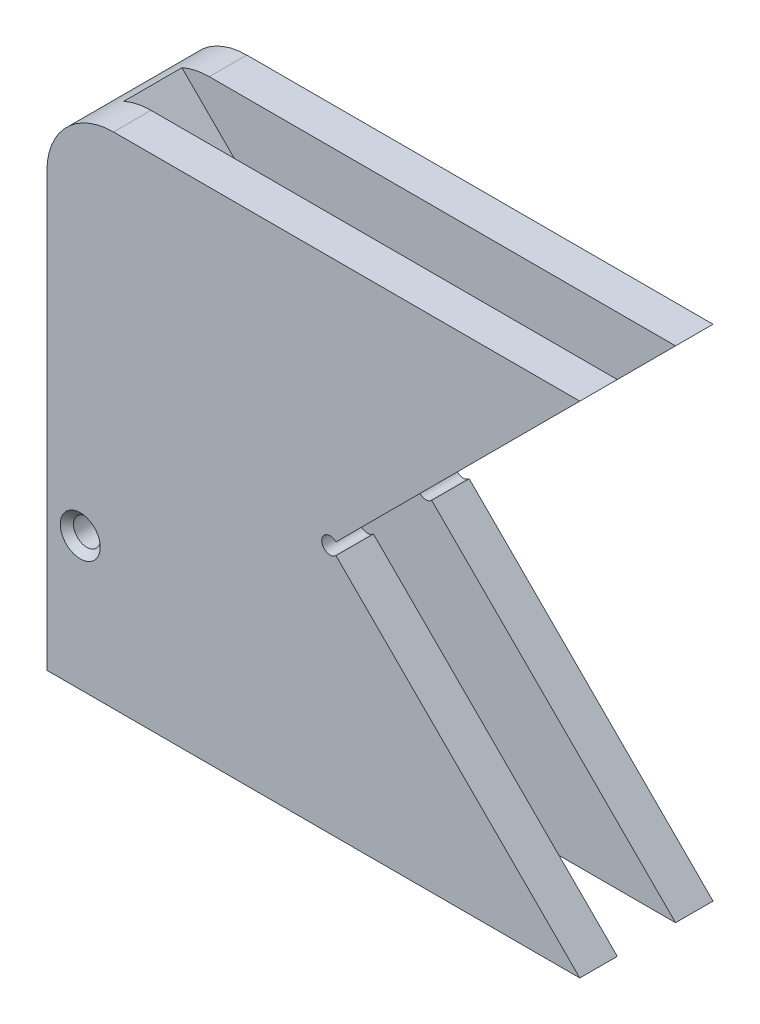
ISO-10303-21;
HEADER;
FILE_DESCRIPTION(('STEP AP214'),'2;1');
FILE_NAME('part.step','',(''),(''),'','','');
FILE_SCHEMA(('AUTOMOTIVE_DESIGN { 1 0 10303 214 1 1 1 1 }'));
ENDSEC;
DATA;
#1=APPLICATION_CONTEXT('core data for automotive mechanical design processes');
#2=APPLICATION_PROTOCOL_DEFINITION('international standard','automotive_design',2000,#1);
#3=PRODUCT_CONTEXT('',#1,'mechanical');
#4=PRODUCT('Part','Part','',(#3));
#5=PRODUCT_RELATED_PRODUCT_CATEGORY('part','',(#4));
#6=PRODUCT_DEFINITION_FORMATION('','',#4);
#7=PRODUCT_DEFINITION_CONTEXT('part definition',#1,'design');
#8=PRODUCT_DEFINITION('design','',#6,#7);
#9=PRODUCT_DEFINITION_SHAPE('','',#8);
#10=(LENGTH_UNIT() NAMED_UNIT(*) SI_UNIT(.MILLI.,.METRE.));
#11=(NAMED_UNIT(*) PLANE_ANGLE_UNIT() SI_UNIT($,.RADIAN.));
#12=(NAMED_UNIT(*) SI_UNIT($,.STERADIAN.) SOLID_ANGLE_UNIT());
#13=UNCERTAINTY_MEASURE_WITH_UNIT(LENGTH_MEASURE(1.E-05),#10,'distance_accuracy_value','');
#14=(GEOMETRIC_REPRESENTATION_CONTEXT(3) GLOBAL_UNCERTAINTY_ASSIGNED_CONTEXT((#13)) GLOBAL_UNIT_ASSIGNED_CONTEXT((#10,
#11,#12)) REPRESENTATION_CONTEXT('',''));
#15=CARTESIAN_POINT('',(0.,0.,0.));
#16=DIRECTION('',(0.,0.,1.));
#17=DIRECTION('',(1.,0.,0.));
#18=AXIS2_PLACEMENT_3D('',#15,#16,#17);
#19=CARTESIAN_POINT('',(53.9749999999995,47.625,12.7));
#20=DIRECTION('',(0.,0.,1.));
#21=DIRECTION('',(1.,0.,0.));
#22=AXIS2_PLACEMENT_3D('',#19,#20,#21);
#23=CYLINDRICAL_SURFACE('',#22,1.58749999999998);
#24=CARTESIAN_POINT('',(53.9749999999995,47.625,-5.55625));
#25=DIRECTION('',(0.,0.,1.));
#26=DIRECTION('',(1.,0.,0.));
#27=AXIS2_PLACEMENT_3D('',#24,#25,#26);
#28=CIRCLE('',#27,1.58749999999998);
#29=CARTESIAN_POINT('',(55.0975320151331,46.5024679848664,-5.55625));
#30=VERTEX_POINT('',#29);
#31=CARTESIAN_POINT('',(52.8524679848658,46.5024679848664,-5.55625));
#32=VERTEX_POINT('',#31);
#33=EDGE_CURVE('E587',#30,#32,#28,.F.);
#34=ORIENTED_EDGE('',*,*,#33,.F.);
#35=DIRECTION('',(0.,0.,1.));
#36=VECTOR('',#35,1.);
#37=CARTESIAN_POINT('',(55.0975320151331,46.5024679848664,12.7));
#38=LINE('',#37,#36);
#39=CARTESIAN_POINT('',(55.0975320151331,46.5024679848664,-12.7));
#40=VERTEX_POINT('',#39);
#41=EDGE_CURVE('E263',#40,#30,#38,.T.);
#42=ORIENTED_EDGE('',*,*,#41,.F.);
#43=CARTESIAN_POINT('',(53.9749999999995,47.625,-12.7));
#44=DIRECTION('',(0.,0.,1.));
#45=DIRECTION('',(1.,0.,0.));
#46=AXIS2_PLACEMENT_3D('',#43,#44,#45);
#47=CIRCLE('',#46,1.58749999999998);
#48=CARTESIAN_POINT('',(55.0975320151331,48.7475320151336,-12.7));
#49=VERTEX_POINT('',#48);
#50=EDGE_CURVE('E275',#49,#40,#47,.T.);
#51=ORIENTED_EDGE('',*,*,#50,.F.);
#52=DIRECTION('',(0.,0.,1.));
#53=VECTOR('',#52,1.);
#54=CARTESIAN_POINT('',(55.0975320151331,48.7475320151336,12.7));
#55=LINE('',#54,#53);
#56=CARTESIAN_POINT('',(55.0975320151331,48.7475320151336,-5.55625));
#57=VERTEX_POINT('',#56);
#58=EDGE_CURVE('E561',#57,#49,#55,.F.);
#59=ORIENTED_EDGE('',*,*,#58,.F.);
#60=CARTESIAN_POINT('',(53.9749999999995,47.625,-5.55625));
#61=DIRECTION('',(0.,0.,1.));
#62=DIRECTION('',(1.,0.,0.));
#63=AXIS2_PLACEMENT_3D('',#60,#61,#62);
#64=CIRCLE('',#63,1.58749999999998);
#65=CARTESIAN_POINT('',(52.8524679848658,48.7475320151336,-5.55625));
#66=VERTEX_POINT('',#65);
#67=EDGE_CURVE('E601',#66,#57,#64,.F.);
#68=ORIENTED_EDGE('',*,*,#67,.F.);
#69=DIRECTION('',(0.,0.,1.));
#70=VECTOR('',#69,1.);
#71=CARTESIAN_POINT('',(52.8524679848658,48.7475320151336,12.7));
#72=LINE('',#71,#70);
#73=CARTESIAN_POINT('',(52.8524679848658,48.7475320151336,5.55625));
#74=VERTEX_POINT('',#73);
#75=EDGE_CURVE('E590',#74,#66,#72,.F.);
#76=ORIENTED_EDGE('',*,*,#75,.F.);
#77=CARTESIAN_POINT('',(53.9749999999995,47.625,5.55625));
#78=DIRECTION('',(0.,0.,1.));
#79=DIRECTION('',(1.,0.,0.));
#80=AXIS2_PLACEMENT_3D('',#77,#78,#79);
#81=CIRCLE('',#80,1.58749999999998);
#82=CARTESIAN_POINT('',(55.0975320151331,48.7475320151336,5.55625));
#83=VERTEX_POINT('',#82);
#84=EDGE_CURVE('E585',#74,#83,#81,.F.);
#85=ORIENTED_EDGE('',*,*,#84,.T.);
#86=CARTESIAN_POINT('',(55.0975320151331,48.7475320151336,12.7));
#87=VERTEX_POINT('',#86);
#88=EDGE_CURVE('E562',#87,#83,#55,.F.);
#89=ORIENTED_EDGE('',*,*,#88,.F.);
#90=CARTESIAN_POINT('',(53.9749999999995,47.625,12.7));
#91=DIRECTION('',(0.,0.,1.));
#92=DIRECTION('',(1.,0.,0.));
#93=AXIS2_PLACEMENT_3D('',#90,#91,#92);
#94=CIRCLE('',#93,1.58749999999998);
#95=CARTESIAN_POINT('',(55.0975320151331,46.5024679848664,12.7));
#96=VERTEX_POINT('',#95);
#97=EDGE_CURVE('E550',#87,#96,#94,.T.);
#98=ORIENTED_EDGE('',*,*,#97,.T.);
#99=CARTESIAN_POINT('',(55.0975320151331,46.5024679848664,5.55625));
#100=VERTEX_POINT('',#99);
#101=EDGE_CURVE('E565',#100,#96,#38,.T.);
#102=ORIENTED_EDGE('',*,*,#101,.F.);
#103=CARTESIAN_POINT('',(53.9749999999995,47.625,5.55625));
#104=DIRECTION('',(0.,0.,1.));
#105=DIRECTION('',(1.,0.,0.));
#106=AXIS2_PLACEMENT_3D('',#103,#104,#105);
#107=CIRCLE('',#106,1.58749999999998);
#108=CARTESIAN_POINT('',(52.8524679848658,46.5024679848664,5.55625));
#109=VERTEX_POINT('',#108);
#110=EDGE_CURVE('E71',#100,#109,#107,.F.);
#111=ORIENTED_EDGE('',*,*,#110,.T.);
#112=DIRECTION('',(0.,0.,1.));
#113=VECTOR('',#112,1.);
#114=CARTESIAN_POINT('',(52.8524679848658,46.5024679848664,12.7));
#115=LINE('',#114,#113);
#116=EDGE_CURVE('E292',#32,#109,#115,.T.);
#117=ORIENTED_EDGE('',*,*,#116,.F.);
#118=EDGE_LOOP('',(#34,#42,#51,#59,#68,#76,#85,#89,#98,#102,#111,#117));
#119=FACE_BOUND('',#118,.T.);
#120=ADVANCED_FACE('F56',(#119),#23,.F.);
#121=CARTESIAN_POINT('',(101.6,0.,12.7));
#122=DIRECTION('',(0.,1.,0.));
#123=DIRECTION('',(-1.,0.,0.));
#124=AXIS2_PLACEMENT_3D('',#121,#122,#123);
#125=PLANE('',#124);
#126=DIRECTION('',(1.,0.,0.));
#127=VECTOR('',#126,1.);
#128=CARTESIAN_POINT('',(0.,0.,-5.55625));
#129=LINE('',#128,#127);
#130=CARTESIAN_POINT('',(6.34999999999897,0.,-5.55625));
#131=VERTEX_POINT('',#130);
#132=CARTESIAN_POINT('',(101.6,0.,-5.55625));
#133=VERTEX_POINT('',#132);
#134=EDGE_CURVE('E276',#131,#133,#129,.T.);
#135=ORIENTED_EDGE('',*,*,#134,.F.);
#136=DIRECTION('',(0.,0.,1.));
#137=VECTOR('',#136,1.);
#138=CARTESIAN_POINT('',(6.34999999999897,0.,-5.55625));
#139=LINE('',#138,#137);
#140=CARTESIAN_POINT('',(6.34999999999897,0.,5.55625));
#141=VERTEX_POINT('',#140);
#142=EDGE_CURVE('E191',#131,#141,#139,.T.);
#143=ORIENTED_EDGE('',*,*,#142,.T.);
#144=DIRECTION('',(1.,0.,0.));
#145=VECTOR('',#144,1.);
#146=CARTESIAN_POINT('',(0.,0.,5.55625));
#147=LINE('',#146,#145);
#148=CARTESIAN_POINT('',(101.6,0.,5.55625));
#149=VERTEX_POINT('',#148);
#150=EDGE_CURVE('E179',#141,#149,#147,.T.);
#151=ORIENTED_EDGE('',*,*,#150,.T.);
#152=DIRECTION('',(0.,0.,-1.));
#153=VECTOR('',#152,1.);
#154=CARTESIAN_POINT('',(101.6,0.,12.7));
#155=LINE('',#154,#153);
#156=CARTESIAN_POINT('',(101.6,0.,12.7));
#157=VERTEX_POINT('',#156);
#158=EDGE_CURVE('E190',#157,#149,#155,.T.);
#159=ORIENTED_EDGE('',*,*,#158,.F.);
#160=DIRECTION('',(1.,0.,0.));
#161=VECTOR('',#160,1.);
#162=CARTESIAN_POINT('',(101.6,0.,12.7));
#163=LINE('',#162,#161);
#164=CARTESIAN_POINT('',(0.,0.,12.7));
#165=VERTEX_POINT('',#164);
#166=EDGE_CURVE('E242',#165,#157,#163,.T.);
#167=ORIENTED_EDGE('',*,*,#166,.F.);
#168=DIRECTION('',(0.,0.,-1.));
#169=VECTOR('',#168,1.);
#170=CARTESIAN_POINT('',(0.,0.,12.7));
#171=LINE('',#170,#169);
#172=CARTESIAN_POINT('',(0.,0.,-12.7));
#173=VERTEX_POINT('',#172);
#174=EDGE_CURVE('E247',#165,#173,#171,.T.);
#175=ORIENTED_EDGE('',*,*,#174,.T.);
#176=DIRECTION('',(1.,0.,0.));
#177=VECTOR('',#176,1.);
#178=CARTESIAN_POINT('',(101.6,0.,-12.7));
#179=LINE('',#178,#177);
#180=CARTESIAN_POINT('',(101.6,0.,-12.7));
#181=VERTEX_POINT('',#180);
#182=EDGE_CURVE('E262',#173,#181,#179,.T.);
#183=ORIENTED_EDGE('',*,*,#182,.T.);
#184=EDGE_CURVE('E199',#133,#181,#155,.T.);
#185=ORIENTED_EDGE('',*,*,#184,.F.);
#186=EDGE_LOOP('',(#135,#143,#151,#159,#167,#175,#183,#185));
#187=FACE_BOUND('',#186,.T.);
#188=ADVANCED_FACE('F188',(#187),#125,.F.);
#189=CARTESIAN_POINT('',(53.9749999999995,47.625,12.7));
#190=DIRECTION('',(-0.707106781186544,-0.707106781186551,0.));
#191=DIRECTION('',(0.707106781186551,-0.707106781186544,0.));
#192=AXIS2_PLACEMENT_3D('',#189,#190,#191);
#193=PLANE('',#192);
#194=DIRECTION('',(-0.707106781186551,0.707106781186544,0.));
#195=VECTOR('',#194,1.);
#196=CARTESIAN_POINT('',(50.7999999999995,50.8,-5.55625));
#197=LINE('',#196,#195);
#198=EDGE_CURVE('E279',#133,#30,#197,.T.);
#199=ORIENTED_EDGE('',*,*,#198,.F.);
#200=ORIENTED_EDGE('',*,*,#184,.T.);
#201=DIRECTION('',(-0.707106781186552,0.707106781186544,0.));
#202=VECTOR('',#201,1.);
#203=CARTESIAN_POINT('',(53.9749999999995,47.625,-12.7));
#204=LINE('',#203,#202);
#205=EDGE_CURVE('E244',#181,#40,#204,.T.);
#206=ORIENTED_EDGE('',*,*,#205,.T.);
#207=ORIENTED_EDGE('',*,*,#41,.T.);
#208=EDGE_LOOP('',(#199,#200,#206,#207));
#209=FACE_BOUND('',#208,.T.);
#210=ADVANCED_FACE('F269',(#209),#193,.F.);
#211=CARTESIAN_POINT('',(15.875,9.525,0.));
#212=DIRECTION('',(-1.,0.,0.));
#213=DIRECTION('',(0.,0.,1.));
#214=AXIS2_PLACEMENT_3D('',#211,#212,#213);
#215=CONICAL_SURFACE('',#214,2.5527,1.02974425867665);
#216=CARTESIAN_POINT('',(15.8748798261767,9.52487982617759,2.5529));
#217=CARTESIAN_POINT('',(15.9031939186595,9.55319391866041,2.50577588170965));
#218=CARTESIAN_POINT('',(15.9313457759996,9.58134577600052,2.45845709519709));
#219=CARTESIAN_POINT('',(15.9872716049516,9.63727160495253,2.36336911620556));
#220=CARTESIAN_POINT('',(16.0150455475612,9.66504554756214,2.31559988962942));
#221=CARTESIAN_POINT('',(16.0978135125158,9.7478135125167,2.17136219448809));
#222=CARTESIAN_POINT('',(16.1521509233622,9.80215092336312,2.07413362651583));
#223=CARTESIAN_POINT('',(16.2596895950018,9.90968959500269,1.8746997010346));
#224=CARTESIAN_POINT('',(16.3128323197108,9.96283231971171,1.77243090670956));
#225=CARTESIAN_POINT('',(16.415468556119,10.0654685561199,1.56434644994297));
#226=CARTESIAN_POINT('',(16.4649648241413,10.1149648241422,1.45853355632126));
#227=CARTESIAN_POINT('',(16.5382286173355,10.1882286173364,1.28915927663996));
#228=CARTESIAN_POINT('',(16.5638378724397,10.2138378724406,1.22719590676887));
#229=CARTESIAN_POINT('',(16.612848185701,10.2628481857019,1.1015170895771));
#230=CARTESIAN_POINT('',(16.636248886237,10.286248886238,1.0378013606547));
#231=CARTESIAN_POINT('',(16.6801255517014,10.3301255517023,0.908746666402781));
#232=CARTESIAN_POINT('',(16.7006150790324,10.3506150790334,0.843417012663825));
#233=CARTESIAN_POINT('',(16.7380464185868,10.3880464185877,0.710747024741038));
#234=CARTESIAN_POINT('',(16.754989546657,10.4049895466579,0.643407446948488));
#235=CARTESIAN_POINT('',(16.7809355892986,10.4309355892995,0.523179370049381));
#236=CARTESIAN_POINT('',(16.7908683095647,10.4408683095656,0.470693799866638));
#237=CARTESIAN_POINT('',(16.8078011903305,10.4578011903314,0.364790336923779));
#238=CARTESIAN_POINT('',(16.8148023786831,10.4648023786841,0.311372777791738));
#239=CARTESIAN_POINT('',(16.8255423544634,10.4755423544643,0.203993498806694));
#240=CARTESIAN_POINT('',(16.8292880877681,10.479288087769,0.150033187228521));
#241=CARTESIAN_POINT('',(16.8333485858833,10.4833485858843,0.0418521600883942));
#242=CARTESIAN_POINT('',(16.8336634316095,10.4836634316104,-0.0123685493020445));
#243=CARTESIAN_POINT('',(16.8308447636784,10.4808447636793,-0.120644908531216));
#244=CARTESIAN_POINT('',(16.8277101543086,10.4777101543095,-0.174700500449924));
#245=CARTESIAN_POINT('',(16.8181553274404,10.4681553274413,-0.282222917462849));
#246=CARTESIAN_POINT('',(16.8117348658582,10.4617348658591,-0.335689698516842));
#247=CARTESIAN_POINT('',(16.7958886339647,10.4458886339656,-0.441874815631848));
#248=CARTESIAN_POINT('',(16.7864542760773,10.4364542760782,-0.494590557841094));
#249=CARTESIAN_POINT('',(16.7649620742098,10.4149620742107,-0.598926642098872));
#250=CARTESIAN_POINT('',(16.7529041774132,10.4029041774141,-0.650546962071636));
#251=CARTESIAN_POINT('',(16.7096374535299,10.3596374535308,-0.818186985193854));
#252=CARTESIAN_POINT('',(16.6737201289875,10.3237201289884,-0.931779962229897));
#253=CARTESIAN_POINT('',(16.5941763825453,10.2441763825462,-1.15346396281501));
#254=CARTESIAN_POINT('',(16.5505344394579,10.2005344394588,-1.26154333373507));
#255=CARTESIAN_POINT('',(16.4578859280128,10.1078859280137,-1.47391290846575));
#256=CARTESIAN_POINT('',(16.4088463881815,10.0588463881824,-1.57817397556247));
#257=CARTESIAN_POINT('',(16.307334221307,9.95733422130788,-1.78312634532815));
#258=CARTESIAN_POINT('',(16.2548643981969,9.9048643981978,-1.88382046234475));
#259=CARTESIAN_POINT('',(16.148424831264,9.79842483126492,-2.08086065173777));
#260=CARTESIAN_POINT('',(16.0944963971004,9.74449639710129,-2.17725171801636));
#261=CARTESIAN_POINT('',(15.9855142917619,9.63551429176282,-2.36695128688017));
#262=CARTESIAN_POINT('',(15.9304803034942,9.5804803034951,-2.46028234559523));
#263=CARTESIAN_POINT('',(15.8748798261767,9.52487982617759,-2.5529));
#264=B_SPLINE_CURVE_WITH_KNOTS('',3,(#216,#217,#218,#219,#220,#221,#222,#223,#224,#225,#226,
#227,#228,#229,#230,#231,#232,#233,#234,#235,#236,#237,#238,#239,#240,#241,#242,#243,#244,#245,
#246,#247,#248,#249,#250,#251,#252,#253,#254,#255,#256,#257,#258,#259,#260,#261,#262,#263),
.UNSPECIFIED.,.F.,.F.,(4,2,2,2,2,2,2,2,2,2,2,2,2,2,2,2,2,2,2,2,2,2,2,4),(0.,0.185515144746626,
0.371044447086561,0.742773614364699,1.12342131631233,1.50377827344698,1.71902444799836,
1.93430541678868,2.1485480268962,2.36271100350883,2.52556574639168,2.68836334127838,
2.85081273053103,3.01325828849386,3.17575546186692,3.3382647078093,3.501241188773,
3.6642209510474,4.03649394436539,4.40952362309005,4.78497374032631,5.16012070952659,
5.5288164733068,5.89333314906287),.UNSPECIFIED.);
#265=CARTESIAN_POINT('',(15.875,9.52500000000092,2.5527));
#266=VERTEX_POINT('',#265);
#267=CARTESIAN_POINT('',(15.875,9.52500000000092,-2.5527));
#268=VERTEX_POINT('',#267);
#269=EDGE_CURVE('E77',#266,#268,#264,.T.);
#270=ORIENTED_EDGE('',*,*,#269,.F.);
#271=CARTESIAN_POINT('',(15.875,9.525,0.));
#272=DIRECTION('',(-1.,0.,0.));
#273=DIRECTION('',(0.,0.,1.));
#274=AXIS2_PLACEMENT_3D('',#271,#272,#273);
#275=CIRCLE('',#274,2.5527);
#276=EDGE_CURVE('E618',#266,#268,#275,.T.);
#277=ORIENTED_EDGE('',*,*,#276,.T.);
#278=EDGE_LOOP('',(#270,#277));
#279=FACE_BOUND('',#278,.T.);
#280=ADVANCED_FACE('F294',(#279),#215,.F.);
#281=CARTESIAN_POINT('',(0.,9.525,0.));
#282=DIRECTION('',(-1.,0.,0.));
#283=DIRECTION('',(0.,0.,1.));
#284=AXIS2_PLACEMENT_3D('',#281,#282,#283);
#285=CYLINDRICAL_SURFACE('',#284,2.5527);
#286=CARTESIAN_POINT('',(1.2573,9.525,0.));
#287=DIRECTION('',(-1.,0.,0.));
#288=DIRECTION('',(0.,0.,1.));
#289=AXIS2_PLACEMENT_3D('',#286,#287,#288);
#290=CIRCLE('',#289,2.5527);
#291=CARTESIAN_POINT('',(1.2573,9.525,2.5527));
#292=VERTEX_POINT('',#291);
#293=EDGE_CURVE('E616',#292,#292,#290,.T.);
#294=ORIENTED_EDGE('',*,*,#293,.T.);
#295=EDGE_LOOP('',(#294));
#296=FACE_BOUND('',#295,.T.);
#297=CARTESIAN_POINT('',(15.8749999999991,9.525,0.));
#298=DIRECTION('',(0.707106781186544,-0.707106781186551,0.));
#299=DIRECTION('',(-0.707106781186551,-0.707106781186544,0.));
#300=AXIS2_PLACEMENT_3D('',#297,#298,#299);
#301=ELLIPSE('',#300,3.61006296066981,2.5527);
#302=EDGE_CURVE('E12',#268,#266,#301,.F.);
#303=ORIENTED_EDGE('',*,*,#302,.F.);
#304=ORIENTED_EDGE('',*,*,#276,.F.);
#305=EDGE_LOOP('',(#303,#304));
#306=FACE_BOUND('',#305,.T.);
#307=ADVANCED_FACE('F334',(#296,#306),#285,.F.);
#308=CARTESIAN_POINT('',(101.6,95.25,12.7));
#309=DIRECTION('',(-0.707106781186544,0.707106781186551,0.));
#310=DIRECTION('',(-0.707106781186551,-0.707106781186544,0.));
#311=AXIS2_PLACEMENT_3D('',#308,#309,#310);
#312=PLANE('',#311);
#313=DIRECTION('',(0.707106781186551,0.707106781186544,0.));
#314=VECTOR('',#313,1.);
#315=CARTESIAN_POINT('',(3.17499999999945,-3.17499999999948,-5.55625));
#316=LINE('',#315,#314);
#317=CARTESIAN_POINT('',(101.6,95.25,-5.55625));
#318=VERTEX_POINT('',#317);
#319=EDGE_CURVE('E592',#57,#318,#316,.T.);
#320=ORIENTED_EDGE('',*,*,#319,.F.);
#321=ORIENTED_EDGE('',*,*,#58,.T.);
#322=DIRECTION('',(0.707106781186551,0.707106781186544,0.));
#323=VECTOR('',#322,1.);
#324=CARTESIAN_POINT('',(101.6,95.25,-12.7));
#325=LINE('',#324,#323);
#326=CARTESIAN_POINT('',(101.6,95.25,-12.7));
#327=VERTEX_POINT('',#326);
#328=EDGE_CURVE('E240',#49,#327,#325,.T.);
#329=ORIENTED_EDGE('',*,*,#328,.T.);
#330=DIRECTION('',(0.,0.,-1.));
#331=VECTOR('',#330,1.);
#332=CARTESIAN_POINT('',(101.6,95.25,12.7));
#333=LINE('',#332,#331);
#334=EDGE_CURVE('E235',#318,#327,#333,.T.);
#335=ORIENTED_EDGE('',*,*,#334,.F.);
#336=EDGE_LOOP('',(#320,#321,#329,#335));
#337=FACE_BOUND('',#336,.T.);
#338=ADVANCED_FACE('F336',(#337),#312,.F.);
#339=CARTESIAN_POINT('',(0.,95.25,12.7));
#340=DIRECTION('',(0.,-1.,0.));
#341=DIRECTION('',(0.,0.,-1.));
#342=AXIS2_PLACEMENT_3D('',#339,#340,#341);
#343=PLANE('',#342);
#344=DIRECTION('',(-1.,0.,0.));
#345=VECTOR('',#344,1.);
#346=CARTESIAN_POINT('',(0.,95.25,-5.55625));
#347=LINE('',#346,#345);
#348=CARTESIAN_POINT('',(12.7,95.25,-5.55625));
#349=VERTEX_POINT('',#348);
#350=EDGE_CURVE('E231',#318,#349,#347,.T.);
#351=ORIENTED_EDGE('',*,*,#350,.F.);
#352=ORIENTED_EDGE('',*,*,#334,.T.);
#353=DIRECTION('',(-1.,0.,0.));
#354=VECTOR('',#353,1.);
#355=CARTESIAN_POINT('',(0.,95.25,-12.7));
#356=LINE('',#355,#354);
#357=CARTESIAN_POINT('',(12.7,95.25,-12.7));
#358=VERTEX_POINT('',#357);
#359=EDGE_CURVE('E234',#327,#358,#356,.T.);
#360=ORIENTED_EDGE('',*,*,#359,.T.);
#361=DIRECTION('',(0.,0.,-1.));
#362=VECTOR('',#361,1.);
#363=CARTESIAN_POINT('',(12.7,95.25,12.7));
#364=LINE('',#363,#362);
#365=EDGE_CURVE('E210',#358,#349,#364,.F.);
#366=ORIENTED_EDGE('',*,*,#365,.T.);
#367=EDGE_LOOP('',(#351,#352,#360,#366));
#368=FACE_BOUND('',#367,.T.);
#369=ADVANCED_FACE('F230',(#368),#343,.F.);
#370=CARTESIAN_POINT('',(12.7,82.55,12.7));
#371=DIRECTION('',(0.,0.,-1.));
#372=DIRECTION('',(-1.,0.,0.));
#373=AXIS2_PLACEMENT_3D('',#370,#371,#372);
#374=CYLINDRICAL_SURFACE('',#373,12.7);
#375=DIRECTION('',(0.,0.,-1.));
#376=VECTOR('',#375,1.);
#377=CARTESIAN_POINT('',(7.47473958736923,94.1252604126298,12.7));
#378=LINE('',#377,#376);
#379=CARTESIAN_POINT('',(7.47473958736923,94.1252604126298,5.55625));
#380=VERTEX_POINT('',#379);
#381=CARTESIAN_POINT('',(7.47473958736923,94.1252604126298,-5.55625));
#382=VERTEX_POINT('',#381);
#383=EDGE_CURVE('E217',#380,#382,#378,.T.);
#384=ORIENTED_EDGE('',*,*,#383,.T.);
#385=CARTESIAN_POINT('',(12.7,82.55,-5.55625));
#386=DIRECTION('',(0.,0.,1.));
#387=DIRECTION('',(1.,0.,0.));
#388=AXIS2_PLACEMENT_3D('',#385,#386,#387);
#389=CIRCLE('',#388,12.7);
#390=EDGE_CURVE('E64',#382,#349,#389,.F.);
#391=ORIENTED_EDGE('',*,*,#390,.T.);
#392=ORIENTED_EDGE('',*,*,#365,.F.);
#393=CARTESIAN_POINT('',(12.7,82.55,-12.7));
#394=DIRECTION('',(0.,0.,-1.));
#395=DIRECTION('',(-1.,0.,0.));
#396=AXIS2_PLACEMENT_3D('',#393,#394,#395);
#397=CIRCLE('',#396,12.7);
#398=CARTESIAN_POINT('',(0.,82.55,-12.7));
#399=VERTEX_POINT('',#398);
#400=EDGE_CURVE('E202',#399,#358,#397,.T.);
#401=ORIENTED_EDGE('',*,*,#400,.F.);
#402=DIRECTION('',(0.,0.,-1.));
#403=VECTOR('',#402,1.);
#404=CARTESIAN_POINT('',(0.,82.55,12.7));
#405=LINE('',#404,#403);
#406=CARTESIAN_POINT('',(0.,82.55,12.7));
#407=VERTEX_POINT('',#406);
#408=EDGE_CURVE('E198',#407,#399,#405,.T.);
#409=ORIENTED_EDGE('',*,*,#408,.F.);
#410=CARTESIAN_POINT('',(12.7,82.55,12.7));
#411=DIRECTION('',(0.,0.,-1.));
#412=DIRECTION('',(-1.,0.,0.));
#413=AXIS2_PLACEMENT_3D('',#410,#411,#412);
#414=CIRCLE('',#413,12.7);
#415=CARTESIAN_POINT('',(12.7,95.25,12.7));
#416=VERTEX_POINT('',#415);
#417=EDGE_CURVE('E213',#416,#407,#414,.F.);
#418=ORIENTED_EDGE('',*,*,#417,.F.);
#419=CARTESIAN_POINT('',(12.7,95.25,5.55625));
#420=VERTEX_POINT('',#419);
#421=EDGE_CURVE('E209',#420,#416,#364,.F.);
#422=ORIENTED_EDGE('',*,*,#421,.F.);
#423=CARTESIAN_POINT('',(12.7,82.55,5.55625));
#424=DIRECTION('',(0.,0.,1.));
#425=DIRECTION('',(1.,0.,0.));
#426=AXIS2_PLACEMENT_3D('',#423,#424,#425);
#427=CIRCLE('',#426,12.7);
#428=EDGE_CURVE('E215',#380,#420,#427,.F.);
#429=ORIENTED_EDGE('',*,*,#428,.F.);
#430=EDGE_LOOP('',(#384,#391,#392,#401,#409,#418,#422,#429));
#431=FACE_BOUND('',#430,.T.);
#432=ADVANCED_FACE('F58',(#431),#374,.T.);
#433=CARTESIAN_POINT('',(0.,0.,12.7));
#434=DIRECTION('',(0.,0.,-1.));
#435=DIRECTION('',(-1.,0.,0.));
#436=AXIS2_PLACEMENT_3D('',#433,#434,#435);
#437=PLANE('',#436);
#438=DIRECTION('',(-1.,0.,0.));
#439=VECTOR('',#438,1.);
#440=CARTESIAN_POINT('',(0.,95.25,12.7));
#441=LINE('',#440,#439);
#442=CARTESIAN_POINT('',(101.6,95.25,12.7));
#443=VERTEX_POINT('',#442);
#444=EDGE_CURVE('E253',#443,#416,#441,.T.);
#445=ORIENTED_EDGE('',*,*,#444,.T.);
#446=ORIENTED_EDGE('',*,*,#417,.T.);
#447=DIRECTION('',(0.,-1.,0.));
#448=VECTOR('',#447,1.);
#449=CARTESIAN_POINT('',(0.,0.,12.7));
#450=LINE('',#449,#448);
#451=EDGE_CURVE('E249',#407,#165,#450,.T.);
#452=ORIENTED_EDGE('',*,*,#451,.T.);
#453=ORIENTED_EDGE('',*,*,#166,.T.);
#454=DIRECTION('',(-0.707106781186552,0.707106781186544,0.));
#455=VECTOR('',#454,1.);
#456=CARTESIAN_POINT('',(53.9749999999995,47.625,12.7));
#457=LINE('',#456,#455);
#458=EDGE_CURVE('E196',#157,#96,#457,.T.);
#459=ORIENTED_EDGE('',*,*,#458,.T.);
#460=ORIENTED_EDGE('',*,*,#97,.F.);
#461=DIRECTION('',(0.707106781186551,0.707106781186544,0.));
#462=VECTOR('',#461,1.);
#463=CARTESIAN_POINT('',(101.6,95.25,12.7));
#464=LINE('',#463,#462);
#465=EDGE_CURVE('E258',#87,#443,#464,.T.);
#466=ORIENTED_EDGE('',*,*,#465,.T.);
#467=EDGE_LOOP('',(#445,#446,#452,#453,#459,#460,#466));
#468=FACE_BOUND('',#467,.T.);
#469=CARTESIAN_POINT('',(6.35,25.4,12.7));
#470=DIRECTION('',(0.,0.,1.));
#471=DIRECTION('',(1.,0.,0.));
#472=AXIS2_PLACEMENT_3D('',#469,#470,#471);
#473=CIRCLE('',#472,3.81);
#474=CARTESIAN_POINT('',(10.16,25.4,12.7));
#475=VERTEX_POINT('',#474);
#476=EDGE_CURVE('E556',#475,#475,#473,.T.);
#477=ORIENTED_EDGE('',*,*,#476,.F.);
#478=EDGE_LOOP('',(#477));
#479=FACE_BOUND('',#478,.T.);
#480=ADVANCED_FACE('F359',(#468,#479),#437,.F.);
#481=CARTESIAN_POINT('',(0.,0.,-12.7));
#482=DIRECTION('',(0.,0.,-1.));
#483=DIRECTION('',(-1.,0.,0.));
#484=AXIS2_PLACEMENT_3D('',#481,#482,#483);
#485=PLANE('',#484);
#486=CARTESIAN_POINT('',(6.35,25.4,-12.7));
#487=DIRECTION('',(0.,0.,1.));
#488=DIRECTION('',(1.,0.,0.));
#489=AXIS2_PLACEMENT_3D('',#486,#487,#488);
#490=CIRCLE('',#489,3.80999999999999);
#491=CARTESIAN_POINT('',(10.16,25.4,-12.7));
#492=VERTEX_POINT('',#491);
#493=EDGE_CURVE('E546',#492,#492,#490,.T.);
#494=ORIENTED_EDGE('',*,*,#493,.T.);
#495=EDGE_LOOP('',(#494));
#496=FACE_BOUND('',#495,.T.);
#497=DIRECTION('',(0.,-1.,0.));
#498=VECTOR('',#497,1.);
#499=CARTESIAN_POINT('',(0.,0.,-12.7));
#500=LINE('',#499,#498);
#501=EDGE_CURVE('E239',#399,#173,#500,.T.);
#502=ORIENTED_EDGE('',*,*,#501,.F.);
#503=ORIENTED_EDGE('',*,*,#400,.T.);
#504=ORIENTED_EDGE('',*,*,#359,.F.);
#505=ORIENTED_EDGE('',*,*,#328,.F.);
#506=ORIENTED_EDGE('',*,*,#50,.T.);
#507=ORIENTED_EDGE('',*,*,#205,.F.);
#508=ORIENTED_EDGE('',*,*,#182,.F.);
#509=EDGE_LOOP('',(#502,#503,#504,#505,#506,#507,#508));
#510=FACE_BOUND('',#509,.T.);
#511=ADVANCED_FACE('F273',(#496,#510),#485,.T.);
#512=ORIENTED_EDGE('',*,*,#158,.T.);
#513=DIRECTION('',(-0.707106781186551,0.707106781186544,0.));
#514=VECTOR('',#513,1.);
#515=CARTESIAN_POINT('',(50.7999999999995,50.8,5.55625));
#516=LINE('',#515,#514);
#517=EDGE_CURVE('E176',#149,#100,#516,.T.);
#518=ORIENTED_EDGE('',*,*,#517,.T.);
#519=ORIENTED_EDGE('',*,*,#101,.T.);
#520=ORIENTED_EDGE('',*,*,#458,.F.);
#521=EDGE_LOOP('',(#512,#518,#519,#520));
#522=FACE_BOUND('',#521,.T.);
#523=ADVANCED_FACE('F194',(#522),#193,.F.);
#524=ORIENTED_EDGE('',*,*,#88,.T.);
#525=DIRECTION('',(0.707106781186551,0.707106781186544,0.));
#526=VECTOR('',#525,1.);
#527=CARTESIAN_POINT('',(3.17499999999945,-3.17499999999948,5.55625));
#528=LINE('',#527,#526);
#529=CARTESIAN_POINT('',(101.6,95.25,5.55625));
#530=VERTEX_POINT('',#529);
#531=EDGE_CURVE('E576',#83,#530,#528,.T.);
#532=ORIENTED_EDGE('',*,*,#531,.T.);
#533=EDGE_CURVE('E204',#443,#530,#333,.T.);
#534=ORIENTED_EDGE('',*,*,#533,.F.);
#535=ORIENTED_EDGE('',*,*,#465,.F.);
#536=EDGE_LOOP('',(#524,#532,#534,#535));
#537=FACE_BOUND('',#536,.T.);
#538=ADVANCED_FACE('F344',(#537),#312,.F.);
#539=ORIENTED_EDGE('',*,*,#533,.T.);
#540=DIRECTION('',(-1.,0.,0.));
#541=VECTOR('',#540,1.);
#542=CARTESIAN_POINT('',(0.,95.25,5.55625));
#543=LINE('',#542,#541);
#544=EDGE_CURVE('E579',#530,#420,#543,.T.);
#545=ORIENTED_EDGE('',*,*,#544,.T.);
#546=ORIENTED_EDGE('',*,*,#421,.T.);
#547=ORIENTED_EDGE('',*,*,#444,.F.);
#548=EDGE_LOOP('',(#539,#545,#546,#547));
#549=FACE_BOUND('',#548,.T.);
#550=ADVANCED_FACE('F368',(#549),#343,.F.);
#551=CARTESIAN_POINT('',(0.,0.,12.7));
#552=DIRECTION('',(1.,0.,0.));
#553=DIRECTION('',(0.,0.,-1.));
#554=AXIS2_PLACEMENT_3D('',#551,#552,#553);
#555=PLANE('',#554);
#556=CARTESIAN_POINT('',(0.,41.275,0.));
#557=DIRECTION('',(-1.,0.,0.));
#558=DIRECTION('',(0.,0.,1.));
#559=AXIS2_PLACEMENT_3D('',#556,#557,#558);
#560=CIRCLE('',#559,3.81);
#561=CARTESIAN_POINT('',(0.,41.275,3.81));
#562=VERTEX_POINT('',#561);
#563=EDGE_CURVE('E604',#562,#562,#560,.T.);
#564=ORIENTED_EDGE('',*,*,#563,.F.);
#565=EDGE_LOOP('',(#564));
#566=FACE_BOUND('',#565,.T.);
#567=CARTESIAN_POINT('',(0.,9.525,0.));
#568=DIRECTION('',(-1.,0.,0.));
#569=DIRECTION('',(0.,0.,1.));
#570=AXIS2_PLACEMENT_3D('',#567,#568,#569);
#571=CIRCLE('',#570,3.81);
#572=CARTESIAN_POINT('',(0.,9.525,3.81));
#573=VERTEX_POINT('',#572);
#574=EDGE_CURVE('E613',#573,#573,#571,.T.);
#575=ORIENTED_EDGE('',*,*,#574,.F.);
#576=EDGE_LOOP('',(#575));
#577=FACE_BOUND('',#576,.T.);
#578=ORIENTED_EDGE('',*,*,#451,.F.);
#579=ORIENTED_EDGE('',*,*,#408,.T.);
#580=ORIENTED_EDGE('',*,*,#501,.T.);
#581=ORIENTED_EDGE('',*,*,#174,.F.);
#582=EDGE_LOOP('',(#578,#579,#580,#581));
#583=FACE_BOUND('',#582,.T.);
#584=ADVANCED_FACE('F365',(#566,#577,#583),#555,.F.);
#585=CARTESIAN_POINT('',(6.35,25.4,-11.4427));
#586=DIRECTION('',(0.,0.,-1.));
#587=DIRECTION('',(-1.,0.,0.));
#588=AXIS2_PLACEMENT_3D('',#585,#586,#587);
#589=CONICAL_SURFACE('',#588,2.55269999999999,0.785398163397448);
#590=ORIENTED_EDGE('',*,*,#493,.F.);
#591=EDGE_LOOP('',(#590));
#592=FACE_BOUND('',#591,.T.);
#593=CARTESIAN_POINT('',(6.35,25.4,-11.4427));
#594=DIRECTION('',(0.,0.,1.));
#595=DIRECTION('',(1.,0.,0.));
#596=AXIS2_PLACEMENT_3D('',#593,#594,#595);
#597=CIRCLE('',#596,2.55269999999999);
#598=CARTESIAN_POINT('',(8.90269999999999,25.4,-11.4427));
#599=VERTEX_POINT('',#598);
#600=EDGE_CURVE('E549',#599,#599,#597,.T.);
#601=ORIENTED_EDGE('',*,*,#600,.T.);
#602=EDGE_LOOP('',(#601));
#603=FACE_BOUND('',#602,.T.);
#604=ADVANCED_FACE('F357',(#592,#603),#589,.F.);
#605=CARTESIAN_POINT('',(6.35,25.4,12.7));
#606=DIRECTION('',(0.,0.,1.));
#607=DIRECTION('',(1.,0.,0.));
#608=AXIS2_PLACEMENT_3D('',#605,#606,#607);
#609=CYLINDRICAL_SURFACE('',#608,2.5527);
#610=ORIENTED_EDGE('',*,*,#600,.F.);
#611=EDGE_LOOP('',(#610));
#612=FACE_BOUND('',#611,.T.);
#613=CARTESIAN_POINT('',(6.35,25.4,11.4427));
#614=DIRECTION('',(0.,0.,1.));
#615=DIRECTION('',(1.,0.,0.));
#616=AXIS2_PLACEMENT_3D('',#613,#614,#615);
#617=CIRCLE('',#616,2.5527);
#618=CARTESIAN_POINT('',(8.9027,25.4,11.4427));
#619=VERTEX_POINT('',#618);
#620=EDGE_CURVE('E551',#619,#619,#617,.T.);
#621=ORIENTED_EDGE('',*,*,#620,.T.);
#622=EDGE_LOOP('',(#621));
#623=FACE_BOUND('',#622,.T.);
#624=ADVANCED_FACE('F493',(#612,#623),#609,.F.);
#625=CARTESIAN_POINT('',(6.35,25.4,12.7));
#626=DIRECTION('',(0.,0.,1.));
#627=DIRECTION('',(1.,0.,0.));
#628=AXIS2_PLACEMENT_3D('',#625,#626,#627);
#629=CONICAL_SURFACE('',#628,3.81,0.785398163397448);
#630=ORIENTED_EDGE('',*,*,#620,.F.);
#631=EDGE_LOOP('',(#630));
#632=FACE_BOUND('',#631,.T.);
#633=ORIENTED_EDGE('',*,*,#476,.T.);
#634=EDGE_LOOP('',(#633));
#635=FACE_BOUND('',#634,.T.);
#636=ADVANCED_FACE('F332',(#632,#635),#629,.F.);
#637=CARTESIAN_POINT('',(0.,9.525,0.));
#638=DIRECTION('',(-1.,0.,0.));
#639=DIRECTION('',(0.,0.,1.));
#640=AXIS2_PLACEMENT_3D('',#637,#638,#639);
#641=CONICAL_SURFACE('',#640,3.81,0.785398163397449);
#642=ORIENTED_EDGE('',*,*,#293,.F.);
#643=EDGE_LOOP('',(#642));
#644=FACE_BOUND('',#643,.T.);
#645=ORIENTED_EDGE('',*,*,#574,.T.);
#646=EDGE_LOOP('',(#645));
#647=FACE_BOUND('',#646,.T.);
#648=ADVANCED_FACE('F329',(#644,#647),#641,.F.);
#649=CARTESIAN_POINT('',(15.875,41.275,0.));
#650=DIRECTION('',(-1.,0.,0.));
#651=DIRECTION('',(0.,0.,1.));
#652=AXIS2_PLACEMENT_3D('',#649,#650,#651);
#653=CONICAL_SURFACE('',#652,2.5527,1.02974425867665);
#654=CARTESIAN_POINT('',(17.4088169021917,41.275,0.));
#655=VERTEX_POINT('',#654);
#656=VERTEX_LOOP('',#655);
#657=FACE_BOUND('',#656,.T.);
#658=CARTESIAN_POINT('',(15.875,41.275,0.));
#659=DIRECTION('',(-1.,0.,0.));
#660=DIRECTION('',(0.,0.,1.));
#661=AXIS2_PLACEMENT_3D('',#658,#659,#660);
#662=CIRCLE('',#661,2.5527);
#663=CARTESIAN_POINT('',(15.875,41.275,2.5527));
#664=VERTEX_POINT('',#663);
#665=EDGE_CURVE('E610',#664,#664,#662,.T.);
#666=ORIENTED_EDGE('',*,*,#665,.T.);
#667=EDGE_LOOP('',(#666));
#668=FACE_BOUND('',#667,.T.);
#669=ADVANCED_FACE('F325',(#657,#668),#653,.F.);
#670=CARTESIAN_POINT('',(0.,41.275,0.));
#671=DIRECTION('',(-1.,0.,0.));
#672=DIRECTION('',(0.,0.,1.));
#673=AXIS2_PLACEMENT_3D('',#670,#671,#672);
#674=CYLINDRICAL_SURFACE('',#673,2.5527);
#675=ORIENTED_EDGE('',*,*,#665,.F.);
#676=EDGE_LOOP('',(#675));
#677=FACE_BOUND('',#676,.T.);
#678=CARTESIAN_POINT('',(1.2573,41.275,0.));
#679=DIRECTION('',(-1.,0.,0.));
#680=DIRECTION('',(0.,0.,1.));
#681=AXIS2_PLACEMENT_3D('',#678,#679,#680);
#682=CIRCLE('',#681,2.5527);
#683=CARTESIAN_POINT('',(1.2573,41.275,2.5527));
#684=VERTEX_POINT('',#683);
#685=EDGE_CURVE('E607',#684,#684,#682,.T.);
#686=ORIENTED_EDGE('',*,*,#685,.T.);
#687=EDGE_LOOP('',(#686));
#688=FACE_BOUND('',#687,.T.);
#689=ADVANCED_FACE('F321',(#677,#688),#674,.F.);
#690=CARTESIAN_POINT('',(0.,41.275,0.));
#691=DIRECTION('',(-1.,0.,0.));
#692=DIRECTION('',(0.,0.,1.));
#693=AXIS2_PLACEMENT_3D('',#690,#691,#692);
#694=CONICAL_SURFACE('',#693,3.81,0.785398163397449);
#695=ORIENTED_EDGE('',*,*,#685,.F.);
#696=EDGE_LOOP('',(#695));
#697=FACE_BOUND('',#696,.T.);
#698=ORIENTED_EDGE('',*,*,#563,.T.);
#699=EDGE_LOOP('',(#698));
#700=FACE_BOUND('',#699,.T.);
#701=ADVANCED_FACE('F317',(#697,#700),#694,.F.);
#702=CARTESIAN_POINT('',(50.7999999999995,50.8,-5.55625));
#703=DIRECTION('',(0.707106781186544,0.707106781186551,0.));
#704=DIRECTION('',(-0.707106781186551,0.707106781186544,0.));
#705=AXIS2_PLACEMENT_3D('',#702,#703,#704);
#706=PLANE('',#705);
#707=ORIENTED_EDGE('',*,*,#75,.T.);
#708=DIRECTION('',(-0.707106781186551,0.707106781186544,0.));
#709=VECTOR('',#708,1.);
#710=CARTESIAN_POINT('',(50.7999999999995,50.8,-5.55625));
#711=LINE('',#710,#709);
#712=EDGE_CURVE('E589',#66,#382,#711,.T.);
#713=ORIENTED_EDGE('',*,*,#712,.T.);
#714=ORIENTED_EDGE('',*,*,#383,.F.);
#715=DIRECTION('',(-0.707106781186551,0.707106781186544,0.));
#716=VECTOR('',#715,1.);
#717=CARTESIAN_POINT('',(50.7999999999995,50.8,5.55625));
#718=LINE('',#717,#716);
#719=EDGE_CURVE('E583',#74,#380,#718,.T.);
#720=ORIENTED_EDGE('',*,*,#719,.F.);
#721=EDGE_LOOP('',(#707,#713,#714,#720));
#722=FACE_BOUND('',#721,.T.);
#723=ADVANCED_FACE('F311',(#722),#706,.T.);
#724=CARTESIAN_POINT('',(0.,0.,-5.55625));
#725=DIRECTION('',(0.,0.,1.));
#726=DIRECTION('',(1.,0.,0.));
#727=AXIS2_PLACEMENT_3D('',#724,#725,#726);
#728=PLANE('',#727);
#729=ORIENTED_EDGE('',*,*,#67,.T.);
#730=ORIENTED_EDGE('',*,*,#319,.T.);
#731=ORIENTED_EDGE('',*,*,#350,.T.);
#732=ORIENTED_EDGE('',*,*,#390,.F.);
#733=ORIENTED_EDGE('',*,*,#712,.F.);
#734=EDGE_LOOP('',(#729,#730,#731,#732,#733));
#735=FACE_BOUND('',#734,.T.);
#736=ADVANCED_FACE('F308',(#735),#728,.T.);
#737=CARTESIAN_POINT('',(0.,0.,5.55625));
#738=DIRECTION('',(0.,0.,1.));
#739=DIRECTION('',(1.,0.,0.));
#740=AXIS2_PLACEMENT_3D('',#737,#738,#739);
#741=PLANE('',#740);
#742=ORIENTED_EDGE('',*,*,#719,.T.);
#743=ORIENTED_EDGE('',*,*,#428,.T.);
#744=ORIENTED_EDGE('',*,*,#544,.F.);
#745=ORIENTED_EDGE('',*,*,#531,.F.);
#746=ORIENTED_EDGE('',*,*,#84,.F.);
#747=EDGE_LOOP('',(#742,#743,#744,#745,#746));
#748=FACE_BOUND('',#747,.T.);
#749=ADVANCED_FACE('F307',(#748),#741,.F.);
#750=CARTESIAN_POINT('',(0.,0.,-5.55625));
#751=DIRECTION('',(0.,0.,1.));
#752=DIRECTION('',(1.,0.,0.));
#753=AXIS2_PLACEMENT_3D('',#750,#751,#752);
#754=PLANE('',#753);
#755=ORIENTED_EDGE('',*,*,#33,.T.);
#756=DIRECTION('',(0.707106781186551,0.707106781186544,0.));
#757=VECTOR('',#756,1.);
#758=CARTESIAN_POINT('',(3.17499999999945,-3.17499999999948,-5.55625));
#759=LINE('',#758,#757);
#760=EDGE_CURVE('E192',#131,#32,#759,.T.);
#761=ORIENTED_EDGE('',*,*,#760,.F.);
#762=ORIENTED_EDGE('',*,*,#134,.T.);
#763=ORIENTED_EDGE('',*,*,#198,.T.);
#764=EDGE_LOOP('',(#755,#761,#762,#763));
#765=FACE_BOUND('',#764,.T.);
#766=ADVANCED_FACE('F304',(#765),#754,.T.);
#767=CARTESIAN_POINT('',(0.,0.,5.55625));
#768=DIRECTION('',(0.,0.,1.));
#769=DIRECTION('',(1.,0.,0.));
#770=AXIS2_PLACEMENT_3D('',#767,#768,#769);
#771=PLANE('',#770);
#772=ORIENTED_EDGE('',*,*,#517,.F.);
#773=ORIENTED_EDGE('',*,*,#150,.F.);
#774=DIRECTION('',(0.707106781186551,0.707106781186544,0.));
#775=VECTOR('',#774,1.);
#776=CARTESIAN_POINT('',(3.17499999999945,-3.17499999999948,5.55625));
#777=LINE('',#776,#775);
#778=EDGE_CURVE('E627',#141,#109,#777,.T.);
#779=ORIENTED_EDGE('',*,*,#778,.T.);
#780=ORIENTED_EDGE('',*,*,#110,.F.);
#781=EDGE_LOOP('',(#772,#773,#779,#780));
#782=FACE_BOUND('',#781,.T.);
#783=ADVANCED_FACE('F178',(#782),#771,.F.);
#784=CARTESIAN_POINT('',(3.17499999999945,-3.17499999999948,-5.55625));
#785=DIRECTION('',(0.707106781186544,-0.707106781186551,0.));
#786=DIRECTION('',(0.707106781186551,0.707106781186544,0.));
#787=AXIS2_PLACEMENT_3D('',#784,#785,#786);
#788=PLANE('',#787);
#789=ORIENTED_EDGE('',*,*,#269,.T.);
#790=ORIENTED_EDGE('',*,*,#302,.T.);
#791=EDGE_LOOP('',(#789,#790));
#792=FACE_BOUND('',#791,.T.);
#793=ORIENTED_EDGE('',*,*,#116,.T.);
#794=ORIENTED_EDGE('',*,*,#778,.F.);
#795=ORIENTED_EDGE('',*,*,#142,.F.);
#796=ORIENTED_EDGE('',*,*,#760,.T.);
#797=EDGE_LOOP('',(#793,#794,#795,#796));
#798=FACE_BOUND('',#797,.T.);
#799=ADVANCED_FACE('F298',(#792,#798),#788,.T.);
#800=CLOSED_SHELL('',(#120,#188,#210,#280,#307,#338,#369,#432,#480,#511,#523,#538,#550,#584,
#604,#624,#636,#648,#669,#689,#701,#723,#736,#749,#766,#783,#799));
#801=MANIFOLD_SOLID_BREP('B2',#800);
#802=ADVANCED_BREP_SHAPE_REPRESENTATION('',(#18,#801),#14);
#803=SHAPE_DEFINITION_REPRESENTATION(#9,#802);
ENDSEC;
END-ISO-10303-21;
